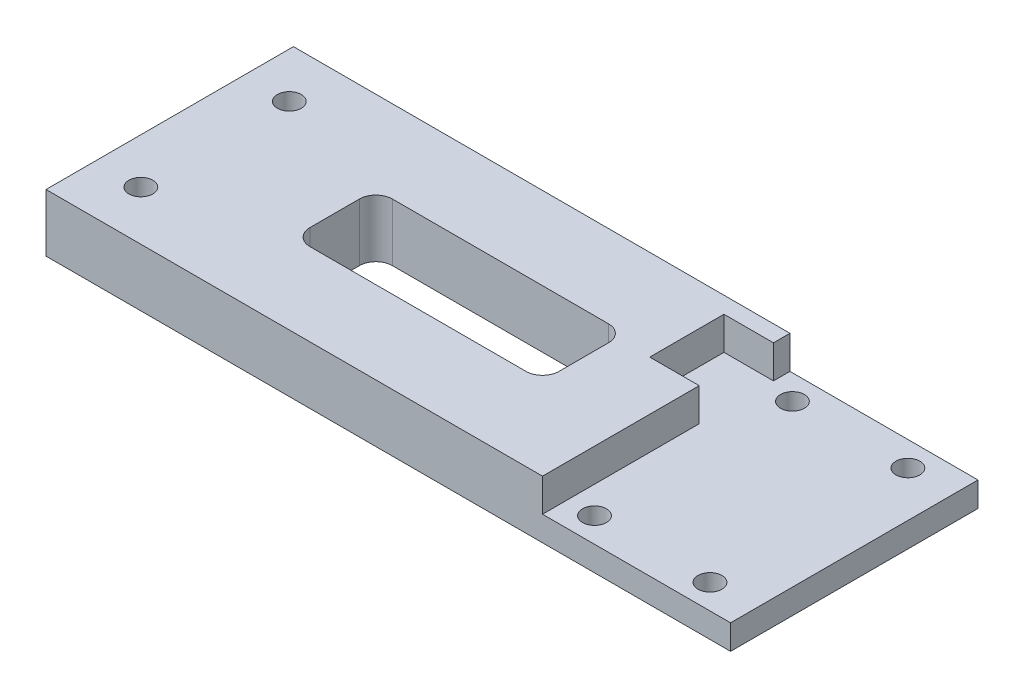
ISO-10303-21;
HEADER;
FILE_DESCRIPTION(('STEP AP214'),'2;1');
FILE_NAME('part.step','',(''),(''),'','','');
FILE_SCHEMA(('AUTOMOTIVE_DESIGN { 1 0 10303 214 1 1 1 1 }'));
ENDSEC;
DATA;
#1=APPLICATION_CONTEXT('core data for automotive mechanical design processes');
#2=APPLICATION_PROTOCOL_DEFINITION('international standard','automotive_design',2000,#1);
#3=PRODUCT_CONTEXT('',#1,'mechanical');
#4=PRODUCT('Part','Part','',(#3));
#5=PRODUCT_RELATED_PRODUCT_CATEGORY('part','',(#4));
#6=PRODUCT_DEFINITION_FORMATION('','',#4);
#7=PRODUCT_DEFINITION_CONTEXT('part definition',#1,'design');
#8=PRODUCT_DEFINITION('design','',#6,#7);
#9=PRODUCT_DEFINITION_SHAPE('','',#8);
#10=(LENGTH_UNIT() NAMED_UNIT(*) SI_UNIT(.MILLI.,.METRE.));
#11=(NAMED_UNIT(*) PLANE_ANGLE_UNIT() SI_UNIT($,.RADIAN.));
#12=(NAMED_UNIT(*) SI_UNIT($,.STERADIAN.) SOLID_ANGLE_UNIT());
#13=UNCERTAINTY_MEASURE_WITH_UNIT(LENGTH_MEASURE(1.E-05),#10,'distance_accuracy_value','');
#14=(GEOMETRIC_REPRESENTATION_CONTEXT(3) GLOBAL_UNCERTAINTY_ASSIGNED_CONTEXT((#13)) GLOBAL_UNIT_ASSIGNED_CONTEXT((#10,
#11,#12)) REPRESENTATION_CONTEXT('',''));
#15=CARTESIAN_POINT('',(0.,0.,0.));
#16=DIRECTION('',(0.,0.,1.));
#17=DIRECTION('',(1.,0.,0.));
#18=AXIS2_PLACEMENT_3D('',#15,#16,#17);
#19=CARTESIAN_POINT('',(-82.5,-8.,-5.99999999999998));
#20=DIRECTION('',(0.,1.,0.));
#21=DIRECTION('',(0.,0.,1.));
#22=AXIS2_PLACEMENT_3D('',#19,#20,#21);
#23=CYLINDRICAL_SURFACE('',#22,1.45);
#24=CARTESIAN_POINT('',(-82.5,7.,-5.99999999999998));
#25=DIRECTION('',(0.,1.,0.));
#26=DIRECTION('',(0.,0.,1.));
#27=AXIS2_PLACEMENT_3D('',#24,#25,#26);
#28=CIRCLE('',#27,1.45);
#29=CARTESIAN_POINT('',(-82.5,7.,-4.54999999999998));
#30=VERTEX_POINT('',#29);
#31=EDGE_CURVE('E261',#30,#30,#28,.T.);
#32=ORIENTED_EDGE('',*,*,#31,.T.);
#33=EDGE_LOOP('',(#32));
#34=FACE_BOUND('',#33,.T.);
#35=CARTESIAN_POINT('',(-82.5,4.,-5.99999999999998));
#36=DIRECTION('',(0.,-1.,0.));
#37=DIRECTION('',(0.,0.,-1.));
#38=AXIS2_PLACEMENT_3D('',#35,#36,#37);
#39=CIRCLE('',#38,1.45);
#40=CARTESIAN_POINT('',(-82.5,4.,-7.44999999999999));
#41=VERTEX_POINT('',#40);
#42=EDGE_CURVE('E39',#41,#41,#39,.F.);
#43=ORIENTED_EDGE('',*,*,#42,.F.);
#44=EDGE_LOOP('',(#43));
#45=FACE_BOUND('',#44,.T.);
#46=ADVANCED_FACE('F35',(#34,#45),#23,.F.);
#47=CARTESIAN_POINT('',(-82.5,-8.,-24.));
#48=DIRECTION('',(0.,1.,0.));
#49=DIRECTION('',(0.,0.,1.));
#50=AXIS2_PLACEMENT_3D('',#47,#48,#49);
#51=CYLINDRICAL_SURFACE('',#50,1.45);
#52=CARTESIAN_POINT('',(-82.5,7.,-24.));
#53=DIRECTION('',(0.,1.,0.));
#54=DIRECTION('',(0.,0.,1.));
#55=AXIS2_PLACEMENT_3D('',#52,#53,#54);
#56=CIRCLE('',#55,1.45);
#57=CARTESIAN_POINT('',(-82.5,7.,-22.55));
#58=VERTEX_POINT('',#57);
#59=EDGE_CURVE('E258',#58,#58,#56,.T.);
#60=ORIENTED_EDGE('',*,*,#59,.T.);
#61=EDGE_LOOP('',(#60));
#62=FACE_BOUND('',#61,.T.);
#63=CARTESIAN_POINT('',(-82.5,4.,-24.));
#64=DIRECTION('',(0.,-1.,0.));
#65=DIRECTION('',(0.,0.,-1.));
#66=AXIS2_PLACEMENT_3D('',#63,#64,#65);
#67=CIRCLE('',#66,1.45);
#68=CARTESIAN_POINT('',(-82.5,4.,-25.45));
#69=VERTEX_POINT('',#68);
#70=EDGE_CURVE('E184',#69,#69,#67,.F.);
#71=ORIENTED_EDGE('',*,*,#70,.F.);
#72=EDGE_LOOP('',(#71));
#73=FACE_BOUND('',#72,.T.);
#74=ADVANCED_FACE('F402',(#62,#73),#51,.F.);
#75=CARTESIAN_POINT('',(0.,3.,0.));
#76=DIRECTION('',(0.,1.,0.));
#77=DIRECTION('',(0.,0.,1.));
#78=AXIS2_PLACEMENT_3D('',#75,#76,#77);
#79=PLANE('',#78);
#80=CARTESIAN_POINT('',(-10.5,3.,-27.));
#81=DIRECTION('',(0.,1.,0.));
#82=DIRECTION('',(0.,0.,1.));
#83=AXIS2_PLACEMENT_3D('',#80,#81,#82);
#84=CIRCLE('',#83,1.45);
#85=CARTESIAN_POINT('',(-10.5,3.,-25.55));
#86=VERTEX_POINT('',#85);
#87=EDGE_CURVE('E215',#86,#86,#84,.T.);
#88=ORIENTED_EDGE('',*,*,#87,.F.);
#89=EDGE_LOOP('',(#88));
#90=FACE_BOUND('',#89,.T.);
#91=CARTESIAN_POINT('',(-10.5,3.,-3.));
#92=DIRECTION('',(0.,1.,0.));
#93=DIRECTION('',(0.,0.,1.));
#94=AXIS2_PLACEMENT_3D('',#91,#92,#93);
#95=CIRCLE('',#94,1.45);
#96=CARTESIAN_POINT('',(-10.5,3.,-1.55));
#97=VERTEX_POINT('',#96);
#98=EDGE_CURVE('E221',#97,#97,#95,.T.);
#99=ORIENTED_EDGE('',*,*,#98,.F.);
#100=EDGE_LOOP('',(#99));
#101=FACE_BOUND('',#100,.T.);
#102=CARTESIAN_POINT('',(-24.5,3.,-27.));
#103=DIRECTION('',(0.,1.,0.));
#104=DIRECTION('',(0.,0.,1.));
#105=AXIS2_PLACEMENT_3D('',#102,#103,#104);
#106=CIRCLE('',#105,1.45);
#107=CARTESIAN_POINT('',(-24.5,3.,-25.55));
#108=VERTEX_POINT('',#107);
#109=EDGE_CURVE('E218',#108,#108,#106,.T.);
#110=ORIENTED_EDGE('',*,*,#109,.F.);
#111=EDGE_LOOP('',(#110));
#112=FACE_BOUND('',#111,.T.);
#113=CARTESIAN_POINT('',(-24.5,3.,-3.));
#114=DIRECTION('',(0.,1.,0.));
#115=DIRECTION('',(0.,0.,1.));
#116=AXIS2_PLACEMENT_3D('',#113,#114,#115);
#117=CIRCLE('',#116,1.45);
#118=CARTESIAN_POINT('',(-24.5,3.,-1.55));
#119=VERTEX_POINT('',#118);
#120=EDGE_CURVE('E212',#119,#119,#117,.T.);
#121=ORIENTED_EDGE('',*,*,#120,.F.);
#122=EDGE_LOOP('',(#121));
#123=FACE_BOUND('',#122,.T.);
#124=DIRECTION('',(-1.,0.,0.));
#125=VECTOR('',#124,1.);
#126=CARTESIAN_POINT('',(-27.8,3.,-19.));
#127=LINE('',#126,#125);
#128=CARTESIAN_POINT('',(-27.8,3.,-19.));
#129=VERTEX_POINT('',#128);
#130=CARTESIAN_POINT('',(-33.8,3.,-19.));
#131=VERTEX_POINT('',#130);
#132=EDGE_CURVE('E179',#129,#131,#127,.T.);
#133=ORIENTED_EDGE('',*,*,#132,.F.);
#134=DIRECTION('',(0.,0.,1.));
#135=VECTOR('',#134,1.);
#136=CARTESIAN_POINT('',(-27.8,3.,-30.));
#137=LINE('',#136,#135);
#138=CARTESIAN_POINT('',(-27.8,3.,0.));
#139=VERTEX_POINT('',#138);
#140=EDGE_CURVE('E52',#129,#139,#137,.T.);
#141=ORIENTED_EDGE('',*,*,#140,.T.);
#142=DIRECTION('',(1.,0.,0.));
#143=VECTOR('',#142,1.);
#144=CARTESIAN_POINT('',(-27.8,3.,0.));
#145=LINE('',#144,#143);
#146=CARTESIAN_POINT('',(-5.,3.,0.));
#147=VERTEX_POINT('',#146);
#148=EDGE_CURVE('E225',#139,#147,#145,.T.);
#149=ORIENTED_EDGE('',*,*,#148,.T.);
#150=DIRECTION('',(0.,0.,-1.));
#151=VECTOR('',#150,1.);
#152=CARTESIAN_POINT('',(-5.,3.,0.));
#153=LINE('',#152,#151);
#154=CARTESIAN_POINT('',(-5.,3.,-30.));
#155=VERTEX_POINT('',#154);
#156=EDGE_CURVE('E228',#147,#155,#153,.T.);
#157=ORIENTED_EDGE('',*,*,#156,.T.);
#158=DIRECTION('',(-1.,0.,0.));
#159=VECTOR('',#158,1.);
#160=CARTESIAN_POINT('',(-5.,3.,-30.));
#161=LINE('',#160,#159);
#162=CARTESIAN_POINT('',(-27.8,3.,-30.));
#163=VERTEX_POINT('',#162);
#164=EDGE_CURVE('E231',#155,#163,#161,.T.);
#165=ORIENTED_EDGE('',*,*,#164,.T.);
#166=DIRECTION('',(0.,0.,-1.));
#167=VECTOR('',#166,1.);
#168=CARTESIAN_POINT('',(-27.8,3.,-30.));
#169=LINE('',#168,#167);
#170=CARTESIAN_POINT('',(-27.8,3.,-28.));
#171=VERTEX_POINT('',#170);
#172=EDGE_CURVE('E199',#171,#163,#169,.T.);
#173=ORIENTED_EDGE('',*,*,#172,.F.);
#174=DIRECTION('',(-1.,0.,0.));
#175=VECTOR('',#174,1.);
#176=CARTESIAN_POINT('',(-27.8,3.,-28.));
#177=LINE('',#176,#175);
#178=CARTESIAN_POINT('',(-33.8,3.,-28.));
#179=VERTEX_POINT('',#178);
#180=EDGE_CURVE('E201',#171,#179,#177,.T.);
#181=ORIENTED_EDGE('',*,*,#180,.T.);
#182=DIRECTION('',(0.,0.,-1.));
#183=VECTOR('',#182,1.);
#184=CARTESIAN_POINT('',(-33.8,3.,-30.));
#185=LINE('',#184,#183);
#186=EDGE_CURVE('E208',#131,#179,#185,.T.);
#187=ORIENTED_EDGE('',*,*,#186,.F.);
#188=EDGE_LOOP('',(#133,#141,#149,#157,#165,#173,#181,#187));
#189=FACE_BOUND('',#188,.T.);
#190=ADVANCED_FACE('F387',(#90,#101,#112,#123,#189),#79,.T.);
#191=CARTESIAN_POINT('',(-33.8,0.,0.));
#192=DIRECTION('',(1.,0.,0.));
#193=DIRECTION('',(0.,0.,-1.));
#194=AXIS2_PLACEMENT_3D('',#191,#192,#193);
#195=PLANE('',#194);
#196=DIRECTION('',(0.,1.,0.));
#197=VECTOR('',#196,1.);
#198=CARTESIAN_POINT('',(-33.8,3.,-19.));
#199=LINE('',#198,#197);
#200=CARTESIAN_POINT('',(-33.8,7.,-19.));
#201=VERTEX_POINT('',#200);
#202=EDGE_CURVE('E60',#131,#201,#199,.T.);
#203=ORIENTED_EDGE('',*,*,#202,.F.);
#204=ORIENTED_EDGE('',*,*,#186,.T.);
#205=DIRECTION('',(0.,-1.,0.));
#206=VECTOR('',#205,1.);
#207=CARTESIAN_POINT('',(-33.8,7.,-28.));
#208=LINE('',#207,#206);
#209=CARTESIAN_POINT('',(-33.8,7.,-28.));
#210=VERTEX_POINT('',#209);
#211=EDGE_CURVE('E191',#210,#179,#208,.T.);
#212=ORIENTED_EDGE('',*,*,#211,.F.);
#213=DIRECTION('',(0.,0.,1.));
#214=VECTOR('',#213,1.);
#215=CARTESIAN_POINT('',(-33.8,7.,-30.));
#216=LINE('',#215,#214);
#217=EDGE_CURVE('E210',#210,#201,#216,.T.);
#218=ORIENTED_EDGE('',*,*,#217,.T.);
#219=EDGE_LOOP('',(#203,#204,#212,#218));
#220=FACE_BOUND('',#219,.T.);
#221=ADVANCED_FACE('F439',(#220),#195,.T.);
#222=CARTESIAN_POINT('',(0.,3.,-30.));
#223=DIRECTION('',(0.,0.,1.));
#224=DIRECTION('',(1.,0.,0.));
#225=AXIS2_PLACEMENT_3D('',#222,#223,#224);
#226=PLANE('',#225);
#227=DIRECTION('',(-1.,0.,0.));
#228=VECTOR('',#227,1.);
#229=CARTESIAN_POINT('',(-27.8,7.,-30.));
#230=LINE('',#229,#228);
#231=CARTESIAN_POINT('',(-27.8,7.,-30.));
#232=VERTEX_POINT('',#231);
#233=CARTESIAN_POINT('',(-88.,7.,-30.));
#234=VERTEX_POINT('',#233);
#235=EDGE_CURVE('E172',#232,#234,#230,.T.);
#236=ORIENTED_EDGE('',*,*,#235,.F.);
#237=DIRECTION('',(0.,1.,0.));
#238=VECTOR('',#237,1.);
#239=CARTESIAN_POINT('',(-27.8,7.,-30.));
#240=LINE('',#239,#238);
#241=EDGE_CURVE('E192',#163,#232,#240,.T.);
#242=ORIENTED_EDGE('',*,*,#241,.F.);
#243=ORIENTED_EDGE('',*,*,#164,.F.);
#244=DIRECTION('',(0.,-1.,0.));
#245=VECTOR('',#244,1.);
#246=CARTESIAN_POINT('',(-5.,10.,-30.));
#247=LINE('',#246,#245);
#248=CARTESIAN_POINT('',(-5.,0.,-30.));
#249=VERTEX_POINT('',#248);
#250=EDGE_CURVE('E271',#155,#249,#247,.T.);
#251=ORIENTED_EDGE('',*,*,#250,.T.);
#252=DIRECTION('',(-1.,0.,0.));
#253=VECTOR('',#252,1.);
#254=CARTESIAN_POINT('',(0.,0.,-30.));
#255=LINE('',#254,#253);
#256=CARTESIAN_POINT('',(-88.,0.,-30.));
#257=VERTEX_POINT('',#256);
#258=EDGE_CURVE('E289',#249,#257,#255,.T.);
#259=ORIENTED_EDGE('',*,*,#258,.T.);
#260=DIRECTION('',(0.,-1.,0.));
#261=VECTOR('',#260,1.);
#262=CARTESIAN_POINT('',(-88.,3.,-30.));
#263=LINE('',#262,#261);
#264=EDGE_CURVE('E299',#234,#257,#263,.T.);
#265=ORIENTED_EDGE('',*,*,#264,.F.);
#266=EDGE_LOOP('',(#236,#242,#243,#251,#259,#265));
#267=FACE_BOUND('',#266,.T.);
#268=ADVANCED_FACE('F377',(#267),#226,.F.);
#269=CARTESIAN_POINT('',(-88.,3.,0.));
#270=DIRECTION('',(1.,0.,0.));
#271=DIRECTION('',(0.,0.,-1.));
#272=AXIS2_PLACEMENT_3D('',#269,#270,#271);
#273=PLANE('',#272);
#274=DIRECTION('',(0.,0.,1.));
#275=VECTOR('',#274,1.);
#276=CARTESIAN_POINT('',(-88.,0.,0.));
#277=LINE('',#276,#275);
#278=CARTESIAN_POINT('',(-88.,0.,0.));
#279=VERTEX_POINT('',#278);
#280=EDGE_CURVE('E291',#257,#279,#277,.T.);
#281=ORIENTED_EDGE('',*,*,#280,.T.);
#282=DIRECTION('',(0.,-1.,0.));
#283=VECTOR('',#282,1.);
#284=CARTESIAN_POINT('',(-88.,3.,0.));
#285=LINE('',#284,#283);
#286=CARTESIAN_POINT('',(-88.,7.,0.));
#287=VERTEX_POINT('',#286);
#288=EDGE_CURVE('E296',#287,#279,#285,.T.);
#289=ORIENTED_EDGE('',*,*,#288,.F.);
#290=DIRECTION('',(0.,0.,1.));
#291=VECTOR('',#290,1.);
#292=CARTESIAN_POINT('',(-88.,7.,-30.));
#293=LINE('',#292,#291);
#294=EDGE_CURVE('E266',#234,#287,#293,.T.);
#295=ORIENTED_EDGE('',*,*,#294,.F.);
#296=ORIENTED_EDGE('',*,*,#264,.T.);
#297=EDGE_LOOP('',(#281,#289,#295,#296));
#298=FACE_BOUND('',#297,.T.);
#299=ADVANCED_FACE('F381',(#298),#273,.F.);
#300=CARTESIAN_POINT('',(0.,3.,0.));
#301=DIRECTION('',(0.,0.,-1.));
#302=DIRECTION('',(-1.,0.,0.));
#303=AXIS2_PLACEMENT_3D('',#300,#301,#302);
#304=PLANE('',#303);
#305=ORIENTED_EDGE('',*,*,#148,.F.);
#306=DIRECTION('',(0.,1.,0.));
#307=VECTOR('',#306,1.);
#308=CARTESIAN_POINT('',(-27.8,2.,0.));
#309=LINE('',#308,#307);
#310=CARTESIAN_POINT('',(-27.8,7.,0.));
#311=VERTEX_POINT('',#310);
#312=EDGE_CURVE('E287',#139,#311,#309,.T.);
#313=ORIENTED_EDGE('',*,*,#312,.T.);
#314=DIRECTION('',(1.,0.,0.));
#315=VECTOR('',#314,1.);
#316=CARTESIAN_POINT('',(-88.,7.,0.));
#317=LINE('',#316,#315);
#318=EDGE_CURVE('E171',#287,#311,#317,.T.);
#319=ORIENTED_EDGE('',*,*,#318,.F.);
#320=ORIENTED_EDGE('',*,*,#288,.T.);
#321=DIRECTION('',(1.,0.,0.));
#322=VECTOR('',#321,1.);
#323=CARTESIAN_POINT('',(0.,0.,0.));
#324=LINE('',#323,#322);
#325=CARTESIAN_POINT('',(-5.,0.,0.));
#326=VERTEX_POINT('',#325);
#327=EDGE_CURVE('E293',#279,#326,#324,.T.);
#328=ORIENTED_EDGE('',*,*,#327,.T.);
#329=DIRECTION('',(0.,-1.,0.));
#330=VECTOR('',#329,1.);
#331=CARTESIAN_POINT('',(-5.,10.,0.));
#332=LINE('',#331,#330);
#333=EDGE_CURVE('E270',#147,#326,#332,.T.);
#334=ORIENTED_EDGE('',*,*,#333,.F.);
#335=EDGE_LOOP('',(#305,#313,#319,#320,#328,#334));
#336=FACE_BOUND('',#335,.T.);
#337=ADVANCED_FACE('F357',(#336),#304,.F.);
#338=CARTESIAN_POINT('',(0.,0.,0.));
#339=DIRECTION('',(0.,1.,0.));
#340=DIRECTION('',(0.,0.,1.));
#341=AXIS2_PLACEMENT_3D('',#338,#339,#340);
#342=PLANE('',#341);
#343=CARTESIAN_POINT('',(-82.5,0.,-5.99999999999998));
#344=DIRECTION('',(0.,-1.,0.));
#345=DIRECTION('',(0.,0.,-1.));
#346=AXIS2_PLACEMENT_3D('',#343,#344,#345);
#347=CIRCLE('',#346,4.00000000000001);
#348=CARTESIAN_POINT('',(-82.5,0.,-9.99999999999999));
#349=VERTEX_POINT('',#348);
#350=EDGE_CURVE('E339',#349,#349,#347,.T.);
#351=ORIENTED_EDGE('',*,*,#350,.F.);
#352=EDGE_LOOP('',(#351));
#353=FACE_BOUND('',#352,.T.);
#354=CARTESIAN_POINT('',(-82.5,0.,-24.));
#355=DIRECTION('',(0.,-1.,0.));
#356=DIRECTION('',(0.,0.,-1.));
#357=AXIS2_PLACEMENT_3D('',#354,#355,#356);
#358=CIRCLE('',#357,4.00000000000001);
#359=CARTESIAN_POINT('',(-82.5,0.,-28.));
#360=VERTEX_POINT('',#359);
#361=EDGE_CURVE('E186',#360,#360,#358,.T.);
#362=ORIENTED_EDGE('',*,*,#361,.F.);
#363=EDGE_LOOP('',(#362));
#364=FACE_BOUND('',#363,.T.);
#365=DIRECTION('',(0.,0.,-1.));
#366=VECTOR('',#365,1.);
#367=CARTESIAN_POINT('',(-37.8,0.,0.));
#368=LINE('',#367,#366);
#369=CARTESIAN_POINT('',(-37.8,0.,-12.));
#370=VERTEX_POINT('',#369);
#371=CARTESIAN_POINT('',(-37.8,0.,-18.));
#372=VERTEX_POINT('',#371);
#373=EDGE_CURVE('E305',#370,#372,#368,.T.);
#374=ORIENTED_EDGE('',*,*,#373,.T.);
#375=CARTESIAN_POINT('',(-39.8,0.,-18.));
#376=DIRECTION('',(0.,1.,0.));
#377=DIRECTION('',(0.,0.,1.));
#378=AXIS2_PLACEMENT_3D('',#375,#376,#377);
#379=CIRCLE('',#378,2.);
#380=CARTESIAN_POINT('',(-39.8,0.,-20.));
#381=VERTEX_POINT('',#380);
#382=EDGE_CURVE('E44',#372,#381,#379,.T.);
#383=ORIENTED_EDGE('',*,*,#382,.T.);
#384=DIRECTION('',(-1.,0.,0.));
#385=VECTOR('',#384,1.);
#386=CARTESIAN_POINT('',(0.,0.,-20.));
#387=LINE('',#386,#385);
#388=CARTESIAN_POINT('',(-66.,0.,-20.));
#389=VERTEX_POINT('',#388);
#390=EDGE_CURVE('E308',#381,#389,#387,.T.);
#391=ORIENTED_EDGE('',*,*,#390,.T.);
#392=CARTESIAN_POINT('',(-66.,0.,-18.));
#393=DIRECTION('',(0.,1.,0.));
#394=DIRECTION('',(0.,0.,1.));
#395=AXIS2_PLACEMENT_3D('',#392,#393,#394);
#396=CIRCLE('',#395,2.);
#397=CARTESIAN_POINT('',(-68.,0.,-18.));
#398=VERTEX_POINT('',#397);
#399=EDGE_CURVE('E11',#389,#398,#396,.T.);
#400=ORIENTED_EDGE('',*,*,#399,.T.);
#401=DIRECTION('',(0.,0.,1.));
#402=VECTOR('',#401,1.);
#403=CARTESIAN_POINT('',(-68.,0.,0.));
#404=LINE('',#403,#402);
#405=CARTESIAN_POINT('',(-68.,0.,-12.));
#406=VERTEX_POINT('',#405);
#407=EDGE_CURVE('E311',#398,#406,#404,.T.);
#408=ORIENTED_EDGE('',*,*,#407,.T.);
#409=CARTESIAN_POINT('',(-66.,0.,-12.));
#410=DIRECTION('',(0.,1.,0.));
#411=DIRECTION('',(0.,0.,1.));
#412=AXIS2_PLACEMENT_3D('',#409,#410,#411);
#413=CIRCLE('',#412,2.);
#414=CARTESIAN_POINT('',(-66.,0.,-9.99999999999999));
#415=VERTEX_POINT('',#414);
#416=EDGE_CURVE('E330',#406,#415,#413,.T.);
#417=ORIENTED_EDGE('',*,*,#416,.T.);
#418=DIRECTION('',(1.,0.,0.));
#419=VECTOR('',#418,1.);
#420=CARTESIAN_POINT('',(0.,0.,-9.99999999999999));
#421=LINE('',#420,#419);
#422=CARTESIAN_POINT('',(-39.8,0.,-9.99999999999999));
#423=VERTEX_POINT('',#422);
#424=EDGE_CURVE('E302',#415,#423,#421,.T.);
#425=ORIENTED_EDGE('',*,*,#424,.T.);
#426=CARTESIAN_POINT('',(-39.8,0.,-12.));
#427=DIRECTION('',(0.,1.,0.));
#428=DIRECTION('',(0.,0.,1.));
#429=AXIS2_PLACEMENT_3D('',#426,#427,#428);
#430=CIRCLE('',#429,2.);
#431=EDGE_CURVE('E332',#423,#370,#430,.T.);
#432=ORIENTED_EDGE('',*,*,#431,.T.);
#433=EDGE_LOOP('',(#374,#383,#391,#400,#408,#417,#425,#432));
#434=FACE_BOUND('',#433,.T.);
#435=CARTESIAN_POINT('',(-10.5,0.,-27.));
#436=DIRECTION('',(0.,1.,0.));
#437=DIRECTION('',(0.,0.,1.));
#438=AXIS2_PLACEMENT_3D('',#435,#436,#437);
#439=CIRCLE('',#438,1.45);
#440=CARTESIAN_POINT('',(-10.5,0.,-25.55));
#441=VERTEX_POINT('',#440);
#442=EDGE_CURVE('E284',#441,#441,#439,.T.);
#443=ORIENTED_EDGE('',*,*,#442,.T.);
#444=EDGE_LOOP('',(#443));
#445=FACE_BOUND('',#444,.T.);
#446=CARTESIAN_POINT('',(-10.5,0.,-3.));
#447=DIRECTION('',(0.,1.,0.));
#448=DIRECTION('',(0.,0.,1.));
#449=AXIS2_PLACEMENT_3D('',#446,#447,#448);
#450=CIRCLE('',#449,1.45);
#451=CARTESIAN_POINT('',(-10.5,0.,-1.55));
#452=VERTEX_POINT('',#451);
#453=EDGE_CURVE('E281',#452,#452,#450,.T.);
#454=ORIENTED_EDGE('',*,*,#453,.T.);
#455=EDGE_LOOP('',(#454));
#456=FACE_BOUND('',#455,.T.);
#457=CARTESIAN_POINT('',(-24.5,0.,-3.));
#458=DIRECTION('',(0.,1.,0.));
#459=DIRECTION('',(0.,0.,1.));
#460=AXIS2_PLACEMENT_3D('',#457,#458,#459);
#461=CIRCLE('',#460,1.45);
#462=CARTESIAN_POINT('',(-24.5,0.,-1.55));
#463=VERTEX_POINT('',#462);
#464=EDGE_CURVE('E278',#463,#463,#461,.T.);
#465=ORIENTED_EDGE('',*,*,#464,.T.);
#466=EDGE_LOOP('',(#465));
#467=FACE_BOUND('',#466,.T.);
#468=CARTESIAN_POINT('',(-24.5,0.,-27.));
#469=DIRECTION('',(0.,1.,0.));
#470=DIRECTION('',(0.,0.,1.));
#471=AXIS2_PLACEMENT_3D('',#468,#469,#470);
#472=CIRCLE('',#471,1.45);
#473=CARTESIAN_POINT('',(-24.5,0.,-25.55));
#474=VERTEX_POINT('',#473);
#475=EDGE_CURVE('E274',#474,#474,#472,.T.);
#476=ORIENTED_EDGE('',*,*,#475,.T.);
#477=EDGE_LOOP('',(#476));
#478=FACE_BOUND('',#477,.T.);
#479=ORIENTED_EDGE('',*,*,#258,.F.);
#480=DIRECTION('',(0.,0.,-1.));
#481=VECTOR('',#480,1.);
#482=CARTESIAN_POINT('',(-5.,0.,0.));
#483=LINE('',#482,#481);
#484=EDGE_CURVE('E268',#326,#249,#483,.T.);
#485=ORIENTED_EDGE('',*,*,#484,.F.);
#486=ORIENTED_EDGE('',*,*,#327,.F.);
#487=ORIENTED_EDGE('',*,*,#280,.F.);
#488=EDGE_LOOP('',(#479,#485,#486,#487));
#489=FACE_BOUND('',#488,.T.);
#490=ADVANCED_FACE('F354',(#353,#364,#434,#445,#456,#467,#478,#489),#342,.F.);
#491=CARTESIAN_POINT('',(-27.8,2.,-30.));
#492=DIRECTION('',(-1.,0.,0.));
#493=DIRECTION('',(0.,0.,1.));
#494=AXIS2_PLACEMENT_3D('',#491,#492,#493);
#495=PLANE('',#494);
#496=ORIENTED_EDGE('',*,*,#140,.F.);
#497=DIRECTION('',(0.,-1.,0.));
#498=VECTOR('',#497,1.);
#499=CARTESIAN_POINT('',(-27.8,7.,-19.));
#500=LINE('',#499,#498);
#501=CARTESIAN_POINT('',(-27.8,7.,-19.));
#502=VERTEX_POINT('',#501);
#503=EDGE_CURVE('E175',#502,#129,#500,.T.);
#504=ORIENTED_EDGE('',*,*,#503,.F.);
#505=DIRECTION('',(0.,0.,-1.));
#506=VECTOR('',#505,1.);
#507=CARTESIAN_POINT('',(-27.8,7.,0.));
#508=LINE('',#507,#506);
#509=EDGE_CURVE('E163',#311,#502,#508,.T.);
#510=ORIENTED_EDGE('',*,*,#509,.F.);
#511=ORIENTED_EDGE('',*,*,#312,.F.);
#512=EDGE_LOOP('',(#496,#504,#510,#511));
#513=FACE_BOUND('',#512,.T.);
#514=ADVANCED_FACE('F176',(#513),#495,.F.);
#515=CARTESIAN_POINT('',(-24.5,-9.,-27.));
#516=DIRECTION('',(0.,1.,0.));
#517=DIRECTION('',(0.,0.,1.));
#518=AXIS2_PLACEMENT_3D('',#515,#516,#517);
#519=CYLINDRICAL_SURFACE('',#518,1.45);
#520=ORIENTED_EDGE('',*,*,#475,.F.);
#521=EDGE_LOOP('',(#520));
#522=FACE_BOUND('',#521,.T.);
#523=ORIENTED_EDGE('',*,*,#109,.T.);
#524=EDGE_LOOP('',(#523));
#525=FACE_BOUND('',#524,.T.);
#526=ADVANCED_FACE('F418',(#522,#525),#519,.F.);
#527=CARTESIAN_POINT('',(-24.5,-9.,-3.));
#528=DIRECTION('',(0.,1.,0.));
#529=DIRECTION('',(0.,0.,1.));
#530=AXIS2_PLACEMENT_3D('',#527,#528,#529);
#531=CYLINDRICAL_SURFACE('',#530,1.45);
#532=ORIENTED_EDGE('',*,*,#464,.F.);
#533=EDGE_LOOP('',(#532));
#534=FACE_BOUND('',#533,.T.);
#535=ORIENTED_EDGE('',*,*,#120,.T.);
#536=EDGE_LOOP('',(#535));
#537=FACE_BOUND('',#536,.T.);
#538=ADVANCED_FACE('F414',(#534,#537),#531,.F.);
#539=CARTESIAN_POINT('',(-10.5,-9.,-3.));
#540=DIRECTION('',(0.,1.,0.));
#541=DIRECTION('',(0.,0.,1.));
#542=AXIS2_PLACEMENT_3D('',#539,#540,#541);
#543=CYLINDRICAL_SURFACE('',#542,1.45);
#544=ORIENTED_EDGE('',*,*,#453,.F.);
#545=EDGE_LOOP('',(#544));
#546=FACE_BOUND('',#545,.T.);
#547=ORIENTED_EDGE('',*,*,#98,.T.);
#548=EDGE_LOOP('',(#547));
#549=FACE_BOUND('',#548,.T.);
#550=ADVANCED_FACE('F417',(#546,#549),#543,.F.);
#551=CARTESIAN_POINT('',(-10.5,-9.,-27.));
#552=DIRECTION('',(0.,1.,0.));
#553=DIRECTION('',(0.,0.,1.));
#554=AXIS2_PLACEMENT_3D('',#551,#552,#553);
#555=CYLINDRICAL_SURFACE('',#554,1.45);
#556=ORIENTED_EDGE('',*,*,#442,.F.);
#557=EDGE_LOOP('',(#556));
#558=FACE_BOUND('',#557,.T.);
#559=ORIENTED_EDGE('',*,*,#87,.T.);
#560=EDGE_LOOP('',(#559));
#561=FACE_BOUND('',#560,.T.);
#562=ADVANCED_FACE('F422',(#558,#561),#555,.F.);
#563=CARTESIAN_POINT('',(-68.,-8.,-20.));
#564=DIRECTION('',(-1.,0.,0.));
#565=DIRECTION('',(0.,0.,1.));
#566=AXIS2_PLACEMENT_3D('',#563,#564,#565);
#567=PLANE('',#566);
#568=DIRECTION('',(0.,1.,0.));
#569=VECTOR('',#568,1.);
#570=CARTESIAN_POINT('',(-68.,3.,-18.));
#571=LINE('',#570,#569);
#572=CARTESIAN_POINT('',(-68.,7.,-18.));
#573=VERTEX_POINT('',#572);
#574=EDGE_CURVE('E318',#398,#573,#571,.T.);
#575=ORIENTED_EDGE('',*,*,#574,.T.);
#576=DIRECTION('',(0.,0.,1.));
#577=VECTOR('',#576,1.);
#578=CARTESIAN_POINT('',(-68.,7.,-18.));
#579=LINE('',#578,#577);
#580=CARTESIAN_POINT('',(-68.,7.,-12.));
#581=VERTEX_POINT('',#580);
#582=EDGE_CURVE('E243',#573,#581,#579,.T.);
#583=ORIENTED_EDGE('',*,*,#582,.T.);
#584=DIRECTION('',(0.,1.,0.));
#585=VECTOR('',#584,1.);
#586=CARTESIAN_POINT('',(-68.,0.,-12.));
#587=LINE('',#586,#585);
#588=EDGE_CURVE('E320',#581,#406,#587,.F.);
#589=ORIENTED_EDGE('',*,*,#588,.T.);
#590=ORIENTED_EDGE('',*,*,#407,.F.);
#591=EDGE_LOOP('',(#575,#583,#589,#590));
#592=FACE_BOUND('',#591,.T.);
#593=ADVANCED_FACE('F426',(#592),#567,.F.);
#594=CARTESIAN_POINT('',(-68.,-8.,-20.));
#595=DIRECTION('',(0.,0.,-1.));
#596=DIRECTION('',(-1.,0.,0.));
#597=AXIS2_PLACEMENT_3D('',#594,#595,#596);
#598=PLANE('',#597);
#599=ORIENTED_EDGE('',*,*,#390,.F.);
#600=DIRECTION('',(0.,1.,0.));
#601=VECTOR('',#600,1.);
#602=CARTESIAN_POINT('',(-39.8,3.,-20.));
#603=LINE('',#602,#601);
#604=CARTESIAN_POINT('',(-39.8,7.,-20.));
#605=VERTEX_POINT('',#604);
#606=EDGE_CURVE('E328',#381,#605,#603,.T.);
#607=ORIENTED_EDGE('',*,*,#606,.T.);
#608=DIRECTION('',(-1.,0.,0.));
#609=VECTOR('',#608,1.);
#610=CARTESIAN_POINT('',(-39.8,7.,-20.));
#611=LINE('',#610,#609);
#612=CARTESIAN_POINT('',(-66.,7.,-20.));
#613=VERTEX_POINT('',#612);
#614=EDGE_CURVE('E237',#605,#613,#611,.T.);
#615=ORIENTED_EDGE('',*,*,#614,.T.);
#616=DIRECTION('',(0.,1.,0.));
#617=VECTOR('',#616,1.);
#618=CARTESIAN_POINT('',(-66.,0.,-20.));
#619=LINE('',#618,#617);
#620=EDGE_CURVE('E326',#613,#389,#619,.F.);
#621=ORIENTED_EDGE('',*,*,#620,.T.);
#622=EDGE_LOOP('',(#599,#607,#615,#621));
#623=FACE_BOUND('',#622,.T.);
#624=ADVANCED_FACE('F456',(#623),#598,.F.);
#625=CARTESIAN_POINT('',(-37.8,-8.,-20.));
#626=DIRECTION('',(1.,0.,0.));
#627=DIRECTION('',(0.,0.,-1.));
#628=AXIS2_PLACEMENT_3D('',#625,#626,#627);
#629=PLANE('',#628);
#630=ORIENTED_EDGE('',*,*,#373,.F.);
#631=DIRECTION('',(0.,1.,0.));
#632=VECTOR('',#631,1.);
#633=CARTESIAN_POINT('',(-37.8,3.,-12.));
#634=LINE('',#633,#632);
#635=CARTESIAN_POINT('',(-37.8,7.,-12.));
#636=VERTEX_POINT('',#635);
#637=EDGE_CURVE('E324',#370,#636,#634,.T.);
#638=ORIENTED_EDGE('',*,*,#637,.T.);
#639=DIRECTION('',(0.,0.,-1.));
#640=VECTOR('',#639,1.);
#641=CARTESIAN_POINT('',(-37.8,7.,-12.));
#642=LINE('',#641,#640);
#643=CARTESIAN_POINT('',(-37.8,7.,-18.));
#644=VERTEX_POINT('',#643);
#645=EDGE_CURVE('E255',#636,#644,#642,.T.);
#646=ORIENTED_EDGE('',*,*,#645,.T.);
#647=DIRECTION('',(0.,1.,0.));
#648=VECTOR('',#647,1.);
#649=CARTESIAN_POINT('',(-37.8,0.,-18.));
#650=LINE('',#649,#648);
#651=EDGE_CURVE('E322',#644,#372,#650,.F.);
#652=ORIENTED_EDGE('',*,*,#651,.T.);
#653=EDGE_LOOP('',(#630,#638,#646,#652));
#654=FACE_BOUND('',#653,.T.);
#655=ADVANCED_FACE('F474',(#654),#629,.F.);
#656=CARTESIAN_POINT('',(-68.,-8.,-9.99999999999999));
#657=DIRECTION('',(0.,0.,1.));
#658=DIRECTION('',(1.,0.,0.));
#659=AXIS2_PLACEMENT_3D('',#656,#657,#658);
#660=PLANE('',#659);
#661=ORIENTED_EDGE('',*,*,#424,.F.);
#662=DIRECTION('',(0.,1.,0.));
#663=VECTOR('',#662,1.);
#664=CARTESIAN_POINT('',(-66.,3.,-9.99999999999999));
#665=LINE('',#664,#663);
#666=CARTESIAN_POINT('',(-66.,7.,-9.99999999999999));
#667=VERTEX_POINT('',#666);
#668=EDGE_CURVE('E316',#415,#667,#665,.T.);
#669=ORIENTED_EDGE('',*,*,#668,.T.);
#670=DIRECTION('',(1.,0.,0.));
#671=VECTOR('',#670,1.);
#672=CARTESIAN_POINT('',(-66.,7.,-9.99999999999999));
#673=LINE('',#672,#671);
#674=CARTESIAN_POINT('',(-39.8,7.,-9.99999999999999));
#675=VERTEX_POINT('',#674);
#676=EDGE_CURVE('E249',#667,#675,#673,.T.);
#677=ORIENTED_EDGE('',*,*,#676,.T.);
#678=DIRECTION('',(0.,1.,0.));
#679=VECTOR('',#678,1.);
#680=CARTESIAN_POINT('',(-39.8,0.,-9.99999999999999));
#681=LINE('',#680,#679);
#682=EDGE_CURVE('E314',#675,#423,#681,.F.);
#683=ORIENTED_EDGE('',*,*,#682,.T.);
#684=EDGE_LOOP('',(#661,#669,#677,#683));
#685=FACE_BOUND('',#684,.T.);
#686=ADVANCED_FACE('F444',(#685),#660,.F.);
#687=CARTESIAN_POINT('',(-66.,-8.,-12.));
#688=DIRECTION('',(0.,-1.,0.));
#689=DIRECTION('',(0.,0.,-1.));
#690=AXIS2_PLACEMENT_3D('',#687,#688,#689);
#691=CYLINDRICAL_SURFACE('',#690,2.);
#692=ORIENTED_EDGE('',*,*,#416,.F.);
#693=ORIENTED_EDGE('',*,*,#588,.F.);
#694=CARTESIAN_POINT('',(-66.,7.,-12.));
#695=DIRECTION('',(0.,1.,0.));
#696=DIRECTION('',(0.,0.,1.));
#697=AXIS2_PLACEMENT_3D('',#694,#695,#696);
#698=CIRCLE('',#697,2.);
#699=EDGE_CURVE('E246',#581,#667,#698,.T.);
#700=ORIENTED_EDGE('',*,*,#699,.T.);
#701=ORIENTED_EDGE('',*,*,#668,.F.);
#702=EDGE_LOOP('',(#692,#693,#700,#701));
#703=FACE_BOUND('',#702,.T.);
#704=ADVANCED_FACE('F440',(#703),#691,.F.);
#705=CARTESIAN_POINT('',(-39.8,-8.,-12.));
#706=DIRECTION('',(0.,-1.,0.));
#707=DIRECTION('',(0.,0.,-1.));
#708=AXIS2_PLACEMENT_3D('',#705,#706,#707);
#709=CYLINDRICAL_SURFACE('',#708,2.);
#710=ORIENTED_EDGE('',*,*,#431,.F.);
#711=ORIENTED_EDGE('',*,*,#682,.F.);
#712=CARTESIAN_POINT('',(-39.8,7.,-12.));
#713=DIRECTION('',(0.,1.,0.));
#714=DIRECTION('',(0.,0.,1.));
#715=AXIS2_PLACEMENT_3D('',#712,#713,#714);
#716=CIRCLE('',#715,2.);
#717=EDGE_CURVE('E252',#675,#636,#716,.T.);
#718=ORIENTED_EDGE('',*,*,#717,.T.);
#719=ORIENTED_EDGE('',*,*,#637,.F.);
#720=EDGE_LOOP('',(#710,#711,#718,#719));
#721=FACE_BOUND('',#720,.T.);
#722=ADVANCED_FACE('F443',(#721),#709,.F.);
#723=CARTESIAN_POINT('',(-39.8,-8.,-18.));
#724=DIRECTION('',(0.,-1.,0.));
#725=DIRECTION('',(0.,0.,-1.));
#726=AXIS2_PLACEMENT_3D('',#723,#724,#725);
#727=CYLINDRICAL_SURFACE('',#726,2.);
#728=ORIENTED_EDGE('',*,*,#382,.F.);
#729=ORIENTED_EDGE('',*,*,#651,.F.);
#730=CARTESIAN_POINT('',(-39.8,7.,-18.));
#731=DIRECTION('',(0.,1.,0.));
#732=DIRECTION('',(0.,0.,1.));
#733=AXIS2_PLACEMENT_3D('',#730,#731,#732);
#734=CIRCLE('',#733,2.);
#735=EDGE_CURVE('E234',#644,#605,#734,.T.);
#736=ORIENTED_EDGE('',*,*,#735,.T.);
#737=ORIENTED_EDGE('',*,*,#606,.F.);
#738=EDGE_LOOP('',(#728,#729,#736,#737));
#739=FACE_BOUND('',#738,.T.);
#740=ADVANCED_FACE('F398',(#739),#727,.F.);
#741=CARTESIAN_POINT('',(-66.,-8.,-18.));
#742=DIRECTION('',(0.,-1.,0.));
#743=DIRECTION('',(0.,0.,-1.));
#744=AXIS2_PLACEMENT_3D('',#741,#742,#743);
#745=CYLINDRICAL_SURFACE('',#744,2.);
#746=ORIENTED_EDGE('',*,*,#399,.F.);
#747=ORIENTED_EDGE('',*,*,#620,.F.);
#748=CARTESIAN_POINT('',(-66.,7.,-18.));
#749=DIRECTION('',(0.,1.,0.));
#750=DIRECTION('',(0.,0.,1.));
#751=AXIS2_PLACEMENT_3D('',#748,#749,#750);
#752=CIRCLE('',#751,2.);
#753=EDGE_CURVE('E240',#613,#573,#752,.T.);
#754=ORIENTED_EDGE('',*,*,#753,.T.);
#755=ORIENTED_EDGE('',*,*,#574,.F.);
#756=EDGE_LOOP('',(#746,#747,#754,#755));
#757=FACE_BOUND('',#756,.T.);
#758=ADVANCED_FACE('F37',(#757),#745,.F.);
#759=CARTESIAN_POINT('',(-5.,10.,0.));
#760=DIRECTION('',(-1.,0.,0.));
#761=DIRECTION('',(0.,0.,1.));
#762=AXIS2_PLACEMENT_3D('',#759,#760,#761);
#763=PLANE('',#762);
#764=ORIENTED_EDGE('',*,*,#333,.T.);
#765=ORIENTED_EDGE('',*,*,#484,.T.);
#766=ORIENTED_EDGE('',*,*,#250,.F.);
#767=ORIENTED_EDGE('',*,*,#156,.F.);
#768=EDGE_LOOP('',(#764,#765,#766,#767));
#769=FACE_BOUND('',#768,.T.);
#770=ADVANCED_FACE('F389',(#769),#763,.F.);
#771=CARTESIAN_POINT('',(0.,7.,0.));
#772=DIRECTION('',(0.,1.,0.));
#773=DIRECTION('',(0.,0.,1.));
#774=AXIS2_PLACEMENT_3D('',#771,#772,#773);
#775=PLANE('',#774);
#776=ORIENTED_EDGE('',*,*,#509,.T.);
#777=DIRECTION('',(1.,0.,0.));
#778=VECTOR('',#777,1.);
#779=CARTESIAN_POINT('',(-33.8,7.,-19.));
#780=LINE('',#779,#778);
#781=EDGE_CURVE('E168',#201,#502,#780,.T.);
#782=ORIENTED_EDGE('',*,*,#781,.F.);
#783=ORIENTED_EDGE('',*,*,#217,.F.);
#784=DIRECTION('',(-1.,0.,0.));
#785=VECTOR('',#784,1.);
#786=CARTESIAN_POINT('',(-27.8,7.,-28.));
#787=LINE('',#786,#785);
#788=CARTESIAN_POINT('',(-27.8,7.,-28.));
#789=VERTEX_POINT('',#788);
#790=EDGE_CURVE('E206',#789,#210,#787,.T.);
#791=ORIENTED_EDGE('',*,*,#790,.F.);
#792=DIRECTION('',(0.,0.,1.));
#793=VECTOR('',#792,1.);
#794=CARTESIAN_POINT('',(-27.8,7.,-30.));
#795=LINE('',#794,#793);
#796=EDGE_CURVE('E195',#232,#789,#795,.T.);
#797=ORIENTED_EDGE('',*,*,#796,.F.);
#798=ORIENTED_EDGE('',*,*,#235,.T.);
#799=ORIENTED_EDGE('',*,*,#294,.T.);
#800=ORIENTED_EDGE('',*,*,#318,.T.);
#801=EDGE_LOOP('',(#776,#782,#783,#791,#797,#798,#799,#800));
#802=FACE_BOUND('',#801,.T.);
#803=ORIENTED_EDGE('',*,*,#31,.F.);
#804=EDGE_LOOP('',(#803));
#805=FACE_BOUND('',#804,.T.);
#806=ORIENTED_EDGE('',*,*,#59,.F.);
#807=EDGE_LOOP('',(#806));
#808=FACE_BOUND('',#807,.T.);
#809=ORIENTED_EDGE('',*,*,#614,.F.);
#810=ORIENTED_EDGE('',*,*,#735,.F.);
#811=ORIENTED_EDGE('',*,*,#645,.F.);
#812=ORIENTED_EDGE('',*,*,#717,.F.);
#813=ORIENTED_EDGE('',*,*,#676,.F.);
#814=ORIENTED_EDGE('',*,*,#699,.F.);
#815=ORIENTED_EDGE('',*,*,#582,.F.);
#816=ORIENTED_EDGE('',*,*,#753,.F.);
#817=EDGE_LOOP('',(#809,#810,#811,#812,#813,#814,#815,#816));
#818=FACE_BOUND('',#817,.T.);
#819=ADVANCED_FACE('F164',(#802,#805,#808,#818),#775,.T.);
#820=CARTESIAN_POINT('',(-27.8,7.,-28.));
#821=DIRECTION('',(0.,0.,-1.));
#822=DIRECTION('',(-1.,0.,0.));
#823=AXIS2_PLACEMENT_3D('',#820,#821,#822);
#824=PLANE('',#823);
#825=ORIENTED_EDGE('',*,*,#211,.T.);
#826=ORIENTED_EDGE('',*,*,#180,.F.);
#827=DIRECTION('',(0.,-1.,0.));
#828=VECTOR('',#827,1.);
#829=CARTESIAN_POINT('',(-27.8,7.,-28.));
#830=LINE('',#829,#828);
#831=EDGE_CURVE('E197',#789,#171,#830,.T.);
#832=ORIENTED_EDGE('',*,*,#831,.F.);
#833=ORIENTED_EDGE('',*,*,#790,.T.);
#834=EDGE_LOOP('',(#825,#826,#832,#833));
#835=FACE_BOUND('',#834,.T.);
#836=ADVANCED_FACE('F396',(#835),#824,.F.);
#837=CARTESIAN_POINT('',(-27.8,0.,0.));
#838=DIRECTION('',(-1.,0.,0.));
#839=DIRECTION('',(0.,0.,1.));
#840=AXIS2_PLACEMENT_3D('',#837,#838,#839);
#841=PLANE('',#840);
#842=ORIENTED_EDGE('',*,*,#241,.T.);
#843=ORIENTED_EDGE('',*,*,#796,.T.);
#844=ORIENTED_EDGE('',*,*,#831,.T.);
#845=ORIENTED_EDGE('',*,*,#172,.T.);
#846=EDGE_LOOP('',(#842,#843,#844,#845));
#847=FACE_BOUND('',#846,.T.);
#848=ADVANCED_FACE('F592',(#847),#841,.F.);
#849=CARTESIAN_POINT('',(0.,0.,-19.));
#850=DIRECTION('',(0.,0.,-1.));
#851=DIRECTION('',(-1.,0.,0.));
#852=AXIS2_PLACEMENT_3D('',#849,#850,#851);
#853=PLANE('',#852);
#854=ORIENTED_EDGE('',*,*,#781,.T.);
#855=ORIENTED_EDGE('',*,*,#503,.T.);
#856=ORIENTED_EDGE('',*,*,#132,.T.);
#857=ORIENTED_EDGE('',*,*,#202,.T.);
#858=EDGE_LOOP('',(#854,#855,#856,#857));
#859=FACE_BOUND('',#858,.T.);
#860=ADVANCED_FACE('F181',(#859),#853,.T.);
#861=CARTESIAN_POINT('',(-82.5,4.,-24.));
#862=DIRECTION('',(0.,-1.,0.));
#863=DIRECTION('',(0.,0.,-1.));
#864=AXIS2_PLACEMENT_3D('',#861,#862,#863);
#865=PLANE('',#864);
#866=CARTESIAN_POINT('',(-82.5,4.,-24.));
#867=DIRECTION('',(0.,-1.,0.));
#868=DIRECTION('',(0.,0.,-1.));
#869=AXIS2_PLACEMENT_3D('',#866,#867,#868);
#870=CIRCLE('',#869,4.00000000000001);
#871=CARTESIAN_POINT('',(-82.5,4.,-28.));
#872=VERTEX_POINT('',#871);
#873=EDGE_CURVE('E344',#872,#872,#870,.T.);
#874=ORIENTED_EDGE('',*,*,#873,.T.);
#875=EDGE_LOOP('',(#874));
#876=FACE_BOUND('',#875,.T.);
#877=ORIENTED_EDGE('',*,*,#70,.T.);
#878=EDGE_LOOP('',(#877));
#879=FACE_BOUND('',#878,.T.);
#880=ADVANCED_FACE('F638',(#876,#879),#865,.T.);
#881=CARTESIAN_POINT('',(-82.5,4.,-24.));
#882=DIRECTION('',(0.,-1.,0.));
#883=DIRECTION('',(0.,0.,-1.));
#884=AXIS2_PLACEMENT_3D('',#881,#882,#883);
#885=CYLINDRICAL_SURFACE('',#884,4.00000000000001);
#886=ORIENTED_EDGE('',*,*,#873,.F.);
#887=EDGE_LOOP('',(#886));
#888=FACE_BOUND('',#887,.T.);
#889=ORIENTED_EDGE('',*,*,#361,.T.);
#890=EDGE_LOOP('',(#889));
#891=FACE_BOUND('',#890,.T.);
#892=ADVANCED_FACE('F352',(#888,#891),#885,.F.);
#893=CARTESIAN_POINT('',(-82.5,4.,-5.99999999999998));
#894=DIRECTION('',(0.,-1.,0.));
#895=DIRECTION('',(0.,0.,-1.));
#896=AXIS2_PLACEMENT_3D('',#893,#894,#895);
#897=PLANE('',#896);
#898=CARTESIAN_POINT('',(-82.5,4.,-5.99999999999998));
#899=DIRECTION('',(0.,-1.,0.));
#900=DIRECTION('',(0.,0.,-1.));
#901=AXIS2_PLACEMENT_3D('',#898,#899,#900);
#902=CIRCLE('',#901,4.00000000000001);
#903=CARTESIAN_POINT('',(-82.5,4.,-9.99999999999999));
#904=VERTEX_POINT('',#903);
#905=EDGE_CURVE('E335',#904,#904,#902,.T.);
#906=ORIENTED_EDGE('',*,*,#905,.T.);
#907=EDGE_LOOP('',(#906));
#908=FACE_BOUND('',#907,.T.);
#909=ORIENTED_EDGE('',*,*,#42,.T.);
#910=EDGE_LOOP('',(#909));
#911=FACE_BOUND('',#910,.T.);
#912=ADVANCED_FACE('F664',(#908,#911),#897,.T.);
#913=CARTESIAN_POINT('',(-82.5,4.,-5.99999999999998));
#914=DIRECTION('',(0.,-1.,0.));
#915=DIRECTION('',(0.,0.,-1.));
#916=AXIS2_PLACEMENT_3D('',#913,#914,#915);
#917=CYLINDRICAL_SURFACE('',#916,4.00000000000001);
#918=ORIENTED_EDGE('',*,*,#905,.F.);
#919=EDGE_LOOP('',(#918));
#920=FACE_BOUND('',#919,.T.);
#921=ORIENTED_EDGE('',*,*,#350,.T.);
#922=EDGE_LOOP('',(#921));
#923=FACE_BOUND('',#922,.T.);
#924=ADVANCED_FACE('F672',(#920,#923),#917,.F.);
#925=CLOSED_SHELL('',(#46,#74,#190,#221,#268,#299,#337,#490,#514,#526,#538,#550,#562,#593,#624,
#655,#686,#704,#722,#740,#758,#770,#819,#836,#848,#860,#880,#892,#912,#924));
#926=MANIFOLD_SOLID_BREP('B2',#925);
#927=ADVANCED_BREP_SHAPE_REPRESENTATION('',(#18,#926),#14);
#928=SHAPE_DEFINITION_REPRESENTATION(#9,#927);
ENDSEC;
END-ISO-10303-21;
